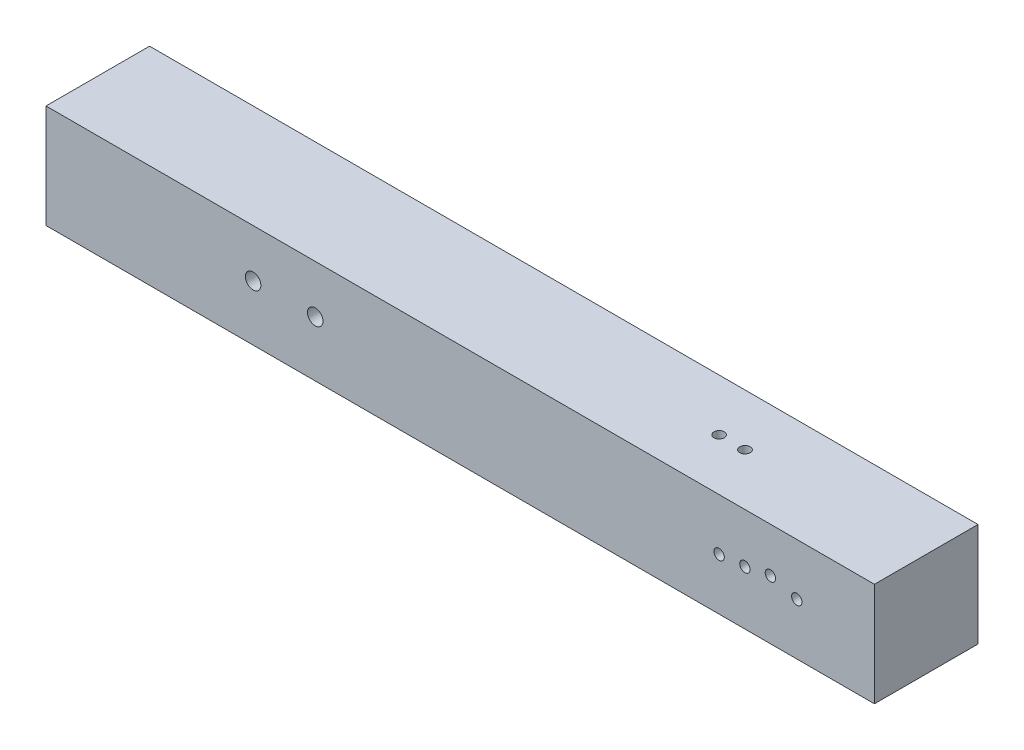
ISO-10303-21;
HEADER;
FILE_DESCRIPTION(('STEP AP214'),'2;1');
FILE_NAME('part.step','',(''),(''),'','','');
FILE_SCHEMA(('AUTOMOTIVE_DESIGN { 1 0 10303 214 1 1 1 1 }'));
ENDSEC;
DATA;
#1=APPLICATION_CONTEXT('core data for automotive mechanical design processes');
#2=APPLICATION_PROTOCOL_DEFINITION('international standard','automotive_design',2000,#1);
#3=PRODUCT_CONTEXT('',#1,'mechanical');
#4=PRODUCT('Part','Part','',(#3));
#5=PRODUCT_RELATED_PRODUCT_CATEGORY('part','',(#4));
#6=PRODUCT_DEFINITION_FORMATION('','',#4);
#7=PRODUCT_DEFINITION_CONTEXT('part definition',#1,'design');
#8=PRODUCT_DEFINITION('design','',#6,#7);
#9=PRODUCT_DEFINITION_SHAPE('','',#8);
#10=(LENGTH_UNIT() NAMED_UNIT(*) SI_UNIT(.MILLI.,.METRE.));
#11=(NAMED_UNIT(*) PLANE_ANGLE_UNIT() SI_UNIT($,.RADIAN.));
#12=(NAMED_UNIT(*) SI_UNIT($,.STERADIAN.) SOLID_ANGLE_UNIT());
#13=UNCERTAINTY_MEASURE_WITH_UNIT(LENGTH_MEASURE(1.E-05),#10,'distance_accuracy_value','');
#14=(GEOMETRIC_REPRESENTATION_CONTEXT(3) GLOBAL_UNCERTAINTY_ASSIGNED_CONTEXT((#13)) GLOBAL_UNIT_ASSIGNED_CONTEXT((#10,
#11,#12)) REPRESENTATION_CONTEXT('',''));
#15=CARTESIAN_POINT('',(0.,0.,0.));
#16=DIRECTION('',(0.,0.,1.));
#17=DIRECTION('',(1.,0.,0.));
#18=AXIS2_PLACEMENT_3D('',#15,#16,#17);
#19=CARTESIAN_POINT('',(0.,0.,12.7));
#20=DIRECTION('',(1.,0.,0.));
#21=DIRECTION('',(0.,0.,-1.));
#22=AXIS2_PLACEMENT_3D('',#19,#20,#21);
#23=PLANE('',#22);
#24=DIRECTION('',(0.,-1.,0.));
#25=VECTOR('',#24,1.);
#26=CARTESIAN_POINT('',(0.,0.,-12.7));
#27=LINE('',#26,#25);
#28=CARTESIAN_POINT('',(0.,25.4,-12.7));
#29=VERTEX_POINT('',#28);
#30=CARTESIAN_POINT('',(0.,0.,-12.7));
#31=VERTEX_POINT('',#30);
#32=EDGE_CURVE('E124',#29,#31,#27,.T.);
#33=ORIENTED_EDGE('',*,*,#32,.T.);
#34=DIRECTION('',(0.,0.,-1.));
#35=VECTOR('',#34,1.);
#36=CARTESIAN_POINT('',(0.,0.,12.7));
#37=LINE('',#36,#35);
#38=CARTESIAN_POINT('',(0.,0.,12.7));
#39=VERTEX_POINT('',#38);
#40=EDGE_CURVE('E11',#39,#31,#37,.T.);
#41=ORIENTED_EDGE('',*,*,#40,.F.);
#42=DIRECTION('',(0.,-1.,0.));
#43=VECTOR('',#42,1.);
#44=CARTESIAN_POINT('',(0.,0.,12.7));
#45=LINE('',#44,#43);
#46=CARTESIAN_POINT('',(0.,25.4,12.7));
#47=VERTEX_POINT('',#46);
#48=EDGE_CURVE('E140',#47,#39,#45,.T.);
#49=ORIENTED_EDGE('',*,*,#48,.F.);
#50=DIRECTION('',(0.,0.,-1.));
#51=VECTOR('',#50,1.);
#52=CARTESIAN_POINT('',(0.,25.4,12.7));
#53=LINE('',#52,#51);
#54=EDGE_CURVE('E126',#47,#29,#53,.T.);
#55=ORIENTED_EDGE('',*,*,#54,.T.);
#56=EDGE_LOOP('',(#33,#41,#49,#55));
#57=FACE_BOUND('',#56,.T.);
#58=ADVANCED_FACE('F43',(#57),#23,.F.);
#59=CARTESIAN_POINT('',(0.,0.,12.7));
#60=DIRECTION('',(0.,1.,0.));
#61=DIRECTION('',(0.,0.,1.));
#62=AXIS2_PLACEMENT_3D('',#59,#60,#61);
#63=PLANE('',#62);
#64=DIRECTION('',(1.,0.,0.));
#65=VECTOR('',#64,1.);
#66=CARTESIAN_POINT('',(0.,0.,-12.7));
#67=LINE('',#66,#65);
#68=CARTESIAN_POINT('',(203.2,0.,-12.7));
#69=VERTEX_POINT('',#68);
#70=EDGE_CURVE('E128',#31,#69,#67,.T.);
#71=ORIENTED_EDGE('',*,*,#70,.T.);
#72=DIRECTION('',(0.,0.,-1.));
#73=VECTOR('',#72,1.);
#74=CARTESIAN_POINT('',(203.2,0.,12.7));
#75=LINE('',#74,#73);
#76=CARTESIAN_POINT('',(203.2,0.,12.7));
#77=VERTEX_POINT('',#76);
#78=EDGE_CURVE('E51',#77,#69,#75,.T.);
#79=ORIENTED_EDGE('',*,*,#78,.F.);
#80=DIRECTION('',(1.,0.,0.));
#81=VECTOR('',#80,1.);
#82=CARTESIAN_POINT('',(0.,0.,12.7));
#83=LINE('',#82,#81);
#84=EDGE_CURVE('E90',#39,#77,#83,.T.);
#85=ORIENTED_EDGE('',*,*,#84,.F.);
#86=ORIENTED_EDGE('',*,*,#40,.T.);
#87=EDGE_LOOP('',(#71,#79,#85,#86));
#88=FACE_BOUND('',#87,.T.);
#89=ADVANCED_FACE('F115',(#88),#63,.F.);
#90=CARTESIAN_POINT('',(203.2,0.,12.7));
#91=DIRECTION('',(-1.,0.,0.));
#92=DIRECTION('',(0.,0.,1.));
#93=AXIS2_PLACEMENT_3D('',#90,#91,#92);
#94=PLANE('',#93);
#95=DIRECTION('',(0.,1.,0.));
#96=VECTOR('',#95,1.);
#97=CARTESIAN_POINT('',(203.2,0.,-12.7));
#98=LINE('',#97,#96);
#99=CARTESIAN_POINT('',(203.2,25.4,-12.7));
#100=VERTEX_POINT('',#99);
#101=EDGE_CURVE('E77',#69,#100,#98,.T.);
#102=ORIENTED_EDGE('',*,*,#101,.T.);
#103=DIRECTION('',(0.,0.,-1.));
#104=VECTOR('',#103,1.);
#105=CARTESIAN_POINT('',(203.2,25.4,12.7));
#106=LINE('',#105,#104);
#107=CARTESIAN_POINT('',(203.2,25.4,12.7));
#108=VERTEX_POINT('',#107);
#109=EDGE_CURVE('E142',#108,#100,#106,.T.);
#110=ORIENTED_EDGE('',*,*,#109,.F.);
#111=DIRECTION('',(0.,1.,0.));
#112=VECTOR('',#111,1.);
#113=CARTESIAN_POINT('',(203.2,0.,12.7));
#114=LINE('',#113,#112);
#115=EDGE_CURVE('E144',#77,#108,#114,.T.);
#116=ORIENTED_EDGE('',*,*,#115,.F.);
#117=ORIENTED_EDGE('',*,*,#78,.T.);
#118=EDGE_LOOP('',(#102,#110,#116,#117));
#119=FACE_BOUND('',#118,.T.);
#120=ADVANCED_FACE('F120',(#119),#94,.F.);
#121=CARTESIAN_POINT('',(0.,25.4,12.7));
#122=DIRECTION('',(0.,-1.,0.));
#123=DIRECTION('',(0.,0.,-1.));
#124=AXIS2_PLACEMENT_3D('',#121,#122,#123);
#125=PLANE('',#124);
#126=CARTESIAN_POINT('',(158.75,25.4,0.));
#127=DIRECTION('',(0.,1.,0.));
#128=DIRECTION('',(0.,0.,-1.));
#129=AXIS2_PLACEMENT_3D('',#126,#127,#128);
#130=CIRCLE('',#129,1.26999999999999);
#131=CARTESIAN_POINT('',(158.75,25.4,-1.26999999999999));
#132=VERTEX_POINT('',#131);
#133=EDGE_CURVE('E344',#132,#132,#130,.T.);
#134=ORIENTED_EDGE('',*,*,#133,.F.);
#135=EDGE_LOOP('',(#134));
#136=FACE_BOUND('',#135,.T.);
#137=CARTESIAN_POINT('',(152.4,25.4,0.));
#138=DIRECTION('',(0.,-1.,0.));
#139=DIRECTION('',(0.,0.,-1.));
#140=AXIS2_PLACEMENT_3D('',#137,#138,#139);
#141=CIRCLE('',#140,1.26999999999999);
#142=CARTESIAN_POINT('',(152.4,25.4,-1.26999999999999));
#143=VERTEX_POINT('',#142);
#144=EDGE_CURVE('E334',#143,#143,#141,.T.);
#145=ORIENTED_EDGE('',*,*,#144,.T.);
#146=EDGE_LOOP('',(#145));
#147=FACE_BOUND('',#146,.T.);
#148=DIRECTION('',(-1.,0.,0.));
#149=VECTOR('',#148,1.);
#150=CARTESIAN_POINT('',(0.,25.4,-12.7));
#151=LINE('',#150,#149);
#152=EDGE_CURVE('E83',#100,#29,#151,.T.);
#153=ORIENTED_EDGE('',*,*,#152,.T.);
#154=ORIENTED_EDGE('',*,*,#54,.F.);
#155=DIRECTION('',(-1.,0.,0.));
#156=VECTOR('',#155,1.);
#157=CARTESIAN_POINT('',(0.,25.4,12.7));
#158=LINE('',#157,#156);
#159=EDGE_CURVE('E59',#108,#47,#158,.T.);
#160=ORIENTED_EDGE('',*,*,#159,.F.);
#161=ORIENTED_EDGE('',*,*,#109,.T.);
#162=EDGE_LOOP('',(#153,#154,#160,#161));
#163=FACE_BOUND('',#162,.T.);
#164=ADVANCED_FACE('F158',(#136,#147,#163),#125,.F.);
#165=CARTESIAN_POINT('',(0.,0.,12.7));
#166=DIRECTION('',(0.,0.,-1.));
#167=DIRECTION('',(-1.,0.,0.));
#168=AXIS2_PLACEMENT_3D('',#165,#166,#167);
#169=PLANE('',#168);
#170=CARTESIAN_POINT('',(50.8,13.6259179731225,12.7));
#171=DIRECTION('',(0.,0.,1.));
#172=DIRECTION('',(1.,0.,0.));
#173=AXIS2_PLACEMENT_3D('',#170,#171,#172);
#174=CIRCLE('',#173,1.905);
#175=CARTESIAN_POINT('',(52.705,13.6259179731225,12.7));
#176=VERTEX_POINT('',#175);
#177=EDGE_CURVE('E356',#176,#176,#174,.T.);
#178=ORIENTED_EDGE('',*,*,#177,.F.);
#179=EDGE_LOOP('',(#178));
#180=FACE_BOUND('',#179,.T.);
#181=CARTESIAN_POINT('',(66.04,13.6259179731225,12.7));
#182=DIRECTION('',(0.,0.,1.));
#183=DIRECTION('',(1.,0.,0.));
#184=AXIS2_PLACEMENT_3D('',#181,#182,#183);
#185=CIRCLE('',#184,1.90500000000001);
#186=CARTESIAN_POINT('',(67.945,13.6259179731225,12.7));
#187=VERTEX_POINT('',#186);
#188=EDGE_CURVE('E353',#187,#187,#185,.T.);
#189=ORIENTED_EDGE('',*,*,#188,.F.);
#190=EDGE_LOOP('',(#189));
#191=FACE_BOUND('',#190,.T.);
#192=CARTESIAN_POINT('',(165.1,12.7,12.7));
#193=DIRECTION('',(0.,0.,1.));
#194=DIRECTION('',(1.,0.,0.));
#195=AXIS2_PLACEMENT_3D('',#192,#193,#194);
#196=CIRCLE('',#195,1.27);
#197=CARTESIAN_POINT('',(166.37,12.7,12.7));
#198=VERTEX_POINT('',#197);
#199=EDGE_CURVE('E133',#198,#198,#196,.T.);
#200=ORIENTED_EDGE('',*,*,#199,.F.);
#201=EDGE_LOOP('',(#200));
#202=FACE_BOUND('',#201,.T.);
#203=CARTESIAN_POINT('',(177.676404473018,14.4674983821928,12.7));
#204=DIRECTION('',(0.,0.,1.));
#205=DIRECTION('',(1.,0.,0.));
#206=AXIS2_PLACEMENT_3D('',#203,#204,#205);
#207=CIRCLE('',#206,1.27);
#208=CARTESIAN_POINT('',(178.946404473018,14.4674983821928,12.7));
#209=VERTEX_POINT('',#208);
#210=EDGE_CURVE('E324',#209,#209,#207,.T.);
#211=ORIENTED_EDGE('',*,*,#210,.F.);
#212=EDGE_LOOP('',(#211));
#213=FACE_BOUND('',#212,.T.);
#214=CARTESIAN_POINT('',(171.425836332883,13.2534389664476,12.7));
#215=DIRECTION('',(0.,0.,1.));
#216=DIRECTION('',(1.,0.,0.));
#217=AXIS2_PLACEMENT_3D('',#214,#215,#216);
#218=CIRCLE('',#217,1.27);
#219=CARTESIAN_POINT('',(172.695836332883,13.2534389664476,12.7));
#220=VERTEX_POINT('',#219);
#221=EDGE_CURVE('E317',#220,#220,#218,.T.);
#222=ORIENTED_EDGE('',*,*,#221,.F.);
#223=EDGE_LOOP('',(#222));
#224=FACE_BOUND('',#223,.T.);
#225=CARTESIAN_POINT('',(184.15,12.7,12.7));
#226=DIRECTION('',(0.,0.,1.));
#227=DIRECTION('',(1.,0.,0.));
#228=AXIS2_PLACEMENT_3D('',#225,#226,#227);
#229=CIRCLE('',#228,1.27);
#230=CARTESIAN_POINT('',(185.42,12.7,12.7));
#231=VERTEX_POINT('',#230);
#232=EDGE_CURVE('E322',#231,#231,#229,.T.);
#233=ORIENTED_EDGE('',*,*,#232,.F.);
#234=EDGE_LOOP('',(#233));
#235=FACE_BOUND('',#234,.T.);
#236=ORIENTED_EDGE('',*,*,#48,.T.);
#237=ORIENTED_EDGE('',*,*,#84,.T.);
#238=ORIENTED_EDGE('',*,*,#115,.T.);
#239=ORIENTED_EDGE('',*,*,#159,.T.);
#240=EDGE_LOOP('',(#236,#237,#238,#239));
#241=FACE_BOUND('',#240,.T.);
#242=ADVANCED_FACE('F148',(#180,#191,#202,#213,#224,#235,#241),#169,.F.);
#243=CARTESIAN_POINT('',(0.,0.,-12.7));
#244=DIRECTION('',(0.,0.,-1.));
#245=DIRECTION('',(-1.,0.,0.));
#246=AXIS2_PLACEMENT_3D('',#243,#244,#245);
#247=PLANE('',#246);
#248=CARTESIAN_POINT('',(50.8,13.6259179731225,-12.7));
#249=DIRECTION('',(0.,0.,1.));
#250=DIRECTION('',(1.,0.,0.));
#251=AXIS2_PLACEMENT_3D('',#248,#249,#250);
#252=CIRCLE('',#251,1.905);
#253=CARTESIAN_POINT('',(52.705,13.6259179731225,-12.7));
#254=VERTEX_POINT('',#253);
#255=EDGE_CURVE('E349',#254,#254,#252,.T.);
#256=ORIENTED_EDGE('',*,*,#255,.T.);
#257=EDGE_LOOP('',(#256));
#258=FACE_BOUND('',#257,.T.);
#259=CARTESIAN_POINT('',(66.04,13.6259179731225,-12.7));
#260=DIRECTION('',(0.,0.,1.));
#261=DIRECTION('',(1.,0.,0.));
#262=AXIS2_PLACEMENT_3D('',#259,#260,#261);
#263=CIRCLE('',#262,1.90500000000001);
#264=CARTESIAN_POINT('',(67.945,13.6259179731225,-12.7));
#265=VERTEX_POINT('',#264);
#266=EDGE_CURVE('E350',#265,#265,#263,.T.);
#267=ORIENTED_EDGE('',*,*,#266,.T.);
#268=EDGE_LOOP('',(#267));
#269=FACE_BOUND('',#268,.T.);
#270=CARTESIAN_POINT('',(165.1,12.7,-12.7));
#271=DIRECTION('',(0.,0.,1.));
#272=DIRECTION('',(1.,0.,0.));
#273=AXIS2_PLACEMENT_3D('',#270,#271,#272);
#274=CIRCLE('',#273,1.27);
#275=CARTESIAN_POINT('',(166.37,12.7,-12.7));
#276=VERTEX_POINT('',#275);
#277=EDGE_CURVE('E129',#276,#276,#274,.T.);
#278=ORIENTED_EDGE('',*,*,#277,.T.);
#279=EDGE_LOOP('',(#278));
#280=FACE_BOUND('',#279,.T.);
#281=CARTESIAN_POINT('',(177.676404473018,14.4674983821928,-12.7));
#282=DIRECTION('',(0.,0.,1.));
#283=DIRECTION('',(1.,0.,0.));
#284=AXIS2_PLACEMENT_3D('',#281,#282,#283);
#285=CIRCLE('',#284,1.27);
#286=CARTESIAN_POINT('',(178.946404473018,14.4674983821928,-12.7));
#287=VERTEX_POINT('',#286);
#288=EDGE_CURVE('E331',#287,#287,#285,.T.);
#289=ORIENTED_EDGE('',*,*,#288,.T.);
#290=EDGE_LOOP('',(#289));
#291=FACE_BOUND('',#290,.T.);
#292=CARTESIAN_POINT('',(171.425836332883,13.2534389664476,-12.7));
#293=DIRECTION('',(0.,0.,1.));
#294=DIRECTION('',(1.,0.,0.));
#295=AXIS2_PLACEMENT_3D('',#292,#293,#294);
#296=CIRCLE('',#295,1.27);
#297=CARTESIAN_POINT('',(172.695836332883,13.2534389664476,-12.7));
#298=VERTEX_POINT('',#297);
#299=EDGE_CURVE('E314',#298,#298,#296,.T.);
#300=ORIENTED_EDGE('',*,*,#299,.T.);
#301=EDGE_LOOP('',(#300));
#302=FACE_BOUND('',#301,.T.);
#303=CARTESIAN_POINT('',(184.15,12.7,-12.7));
#304=DIRECTION('',(0.,0.,1.));
#305=DIRECTION('',(1.,0.,0.));
#306=AXIS2_PLACEMENT_3D('',#303,#304,#305);
#307=CIRCLE('',#306,1.27);
#308=CARTESIAN_POINT('',(185.42,12.7,-12.7));
#309=VERTEX_POINT('',#308);
#310=EDGE_CURVE('E319',#309,#309,#307,.T.);
#311=ORIENTED_EDGE('',*,*,#310,.T.);
#312=EDGE_LOOP('',(#311));
#313=FACE_BOUND('',#312,.T.);
#314=ORIENTED_EDGE('',*,*,#32,.F.);
#315=ORIENTED_EDGE('',*,*,#152,.F.);
#316=ORIENTED_EDGE('',*,*,#101,.F.);
#317=ORIENTED_EDGE('',*,*,#70,.F.);
#318=EDGE_LOOP('',(#314,#315,#316,#317));
#319=FACE_BOUND('',#318,.T.);
#320=ADVANCED_FACE('F145',(#258,#269,#280,#291,#302,#313,#319),#247,.T.);
#321=CARTESIAN_POINT('',(184.15,12.7,-12.7));
#322=DIRECTION('',(0.,0.,1.));
#323=DIRECTION('',(1.,0.,0.));
#324=AXIS2_PLACEMENT_3D('',#321,#322,#323);
#325=CYLINDRICAL_SURFACE('',#324,1.27);
#326=ORIENTED_EDGE('',*,*,#310,.F.);
#327=EDGE_LOOP('',(#326));
#328=FACE_BOUND('',#327,.T.);
#329=ORIENTED_EDGE('',*,*,#232,.T.);
#330=EDGE_LOOP('',(#329));
#331=FACE_BOUND('',#330,.T.);
#332=ADVANCED_FACE('F147',(#328,#331),#325,.F.);
#333=CARTESIAN_POINT('',(171.425836332883,13.2534389664476,-12.7));
#334=DIRECTION('',(0.,0.,1.));
#335=DIRECTION('',(1.,0.,0.));
#336=AXIS2_PLACEMENT_3D('',#333,#334,#335);
#337=CYLINDRICAL_SURFACE('',#336,1.27);
#338=ORIENTED_EDGE('',*,*,#299,.F.);
#339=EDGE_LOOP('',(#338));
#340=FACE_BOUND('',#339,.T.);
#341=ORIENTED_EDGE('',*,*,#221,.T.);
#342=EDGE_LOOP('',(#341));
#343=FACE_BOUND('',#342,.T.);
#344=ADVANCED_FACE('F155',(#340,#343),#337,.F.);
#345=CARTESIAN_POINT('',(177.676404473018,14.4674983821928,-12.7));
#346=DIRECTION('',(0.,0.,1.));
#347=DIRECTION('',(1.,0.,0.));
#348=AXIS2_PLACEMENT_3D('',#345,#346,#347);
#349=CYLINDRICAL_SURFACE('',#348,1.27);
#350=ORIENTED_EDGE('',*,*,#288,.F.);
#351=EDGE_LOOP('',(#350));
#352=FACE_BOUND('',#351,.T.);
#353=ORIENTED_EDGE('',*,*,#210,.T.);
#354=EDGE_LOOP('',(#353));
#355=FACE_BOUND('',#354,.T.);
#356=ADVANCED_FACE('F249',(#352,#355),#349,.F.);
#357=CARTESIAN_POINT('',(165.1,12.7,-12.7));
#358=DIRECTION('',(0.,0.,1.));
#359=DIRECTION('',(1.,0.,0.));
#360=AXIS2_PLACEMENT_3D('',#357,#358,#359);
#361=CYLINDRICAL_SURFACE('',#360,1.27);
#362=ORIENTED_EDGE('',*,*,#277,.F.);
#363=EDGE_LOOP('',(#362));
#364=FACE_BOUND('',#363,.T.);
#365=ORIENTED_EDGE('',*,*,#199,.T.);
#366=EDGE_LOOP('',(#365));
#367=FACE_BOUND('',#366,.T.);
#368=ADVANCED_FACE('F239',(#364,#367),#361,.F.);
#369=CARTESIAN_POINT('',(152.4,13.0402954743875,0.));
#370=DIRECTION('',(0.,-1.,0.));
#371=DIRECTION('',(0.,0.,-1.));
#372=AXIS2_PLACEMENT_3D('',#369,#370,#371);
#373=CYLINDRICAL_SURFACE('',#372,1.26999999999999);
#374=ORIENTED_EDGE('',*,*,#144,.F.);
#375=EDGE_LOOP('',(#374));
#376=FACE_BOUND('',#375,.T.);
#377=CARTESIAN_POINT('',(152.4,15.24,0.));
#378=DIRECTION('',(0.,-1.,0.));
#379=DIRECTION('',(0.,0.,-1.));
#380=AXIS2_PLACEMENT_3D('',#377,#378,#379);
#381=CIRCLE('',#380,1.26999999999999);
#382=CARTESIAN_POINT('',(152.4,15.24,-1.26999999999999));
#383=VERTEX_POINT('',#382);
#384=EDGE_CURVE('E341',#383,#383,#381,.T.);
#385=ORIENTED_EDGE('',*,*,#384,.T.);
#386=EDGE_LOOP('',(#385));
#387=FACE_BOUND('',#386,.T.);
#388=ADVANCED_FACE('F230',(#376,#387),#373,.F.);
#389=CARTESIAN_POINT('',(152.4,13.0402954743875,0.));
#390=DIRECTION('',(0.,1.,0.));
#391=DIRECTION('',(0.,0.,1.));
#392=AXIS2_PLACEMENT_3D('',#389,#390,#391);
#393=CONICAL_SURFACE('',#392,0.,0.523598775598293);
#394=ORIENTED_EDGE('',*,*,#384,.F.);
#395=EDGE_LOOP('',(#394));
#396=FACE_BOUND('',#395,.T.);
#397=CARTESIAN_POINT('',(152.4,13.0402954743875,0.));
#398=VERTEX_POINT('',#397);
#399=VERTEX_LOOP('',#398);
#400=FACE_BOUND('',#399,.T.);
#401=ADVANCED_FACE('F110',(#396,#400),#393,.F.);
#402=CARTESIAN_POINT('',(158.75,13.0402954743875,0.));
#403=DIRECTION('',(0.,-1.,0.));
#404=DIRECTION('',(0.,0.,-1.));
#405=AXIS2_PLACEMENT_3D('',#402,#403,#404);
#406=CYLINDRICAL_SURFACE('',#405,1.26999999999999);
#407=ORIENTED_EDGE('',*,*,#133,.T.);
#408=EDGE_LOOP('',(#407));
#409=FACE_BOUND('',#408,.T.);
#410=CARTESIAN_POINT('',(158.75,15.24,0.));
#411=DIRECTION('',(0.,1.,0.));
#412=DIRECTION('',(0.,0.,-1.));
#413=AXIS2_PLACEMENT_3D('',#410,#411,#412);
#414=CIRCLE('',#413,1.26999999999999);
#415=CARTESIAN_POINT('',(158.75,15.24,-1.26999999999999));
#416=VERTEX_POINT('',#415);
#417=EDGE_CURVE('E347',#416,#416,#414,.T.);
#418=ORIENTED_EDGE('',*,*,#417,.F.);
#419=EDGE_LOOP('',(#418));
#420=FACE_BOUND('',#419,.T.);
#421=ADVANCED_FACE('F100',(#409,#420),#406,.F.);
#422=CARTESIAN_POINT('',(158.75,13.0402954743875,0.));
#423=DIRECTION('',(0.,1.,0.));
#424=DIRECTION('',(0.,0.,1.));
#425=AXIS2_PLACEMENT_3D('',#422,#423,#424);
#426=CONICAL_SURFACE('',#425,0.,0.523598775598293);
#427=ORIENTED_EDGE('',*,*,#417,.T.);
#428=EDGE_LOOP('',(#427));
#429=FACE_BOUND('',#428,.T.);
#430=CARTESIAN_POINT('',(158.75,13.0402954743875,0.));
#431=VERTEX_POINT('',#430);
#432=VERTEX_LOOP('',#431);
#433=FACE_BOUND('',#432,.T.);
#434=ADVANCED_FACE('F97',(#429,#433),#426,.F.);
#435=CARTESIAN_POINT('',(66.04,13.6259179731225,-12.7));
#436=DIRECTION('',(0.,0.,1.));
#437=DIRECTION('',(1.,0.,0.));
#438=AXIS2_PLACEMENT_3D('',#435,#436,#437);
#439=CYLINDRICAL_SURFACE('',#438,1.90500000000001);
#440=ORIENTED_EDGE('',*,*,#266,.F.);
#441=EDGE_LOOP('',(#440));
#442=FACE_BOUND('',#441,.T.);
#443=ORIENTED_EDGE('',*,*,#188,.T.);
#444=EDGE_LOOP('',(#443));
#445=FACE_BOUND('',#444,.T.);
#446=ADVANCED_FACE('F99',(#442,#445),#439,.F.);
#447=CARTESIAN_POINT('',(50.8,13.6259179731225,-12.7));
#448=DIRECTION('',(0.,0.,1.));
#449=DIRECTION('',(1.,0.,0.));
#450=AXIS2_PLACEMENT_3D('',#447,#448,#449);
#451=CYLINDRICAL_SURFACE('',#450,1.905);
#452=ORIENTED_EDGE('',*,*,#255,.F.);
#453=EDGE_LOOP('',(#452));
#454=FACE_BOUND('',#453,.T.);
#455=ORIENTED_EDGE('',*,*,#177,.T.);
#456=EDGE_LOOP('',(#455));
#457=FACE_BOUND('',#456,.T.);
#458=ADVANCED_FACE('F107',(#454,#457),#451,.F.);
#459=CLOSED_SHELL('',(#58,#89,#120,#164,#242,#320,#332,#344,#356,#368,#388,#401,#421,#434,#446,#458));
#460=MANIFOLD_SOLID_BREP('B2',#459);
#461=ADVANCED_BREP_SHAPE_REPRESENTATION('',(#18,#460),#14);
#462=SHAPE_DEFINITION_REPRESENTATION(#9,#461);
ENDSEC;
END-ISO-10303-21;
